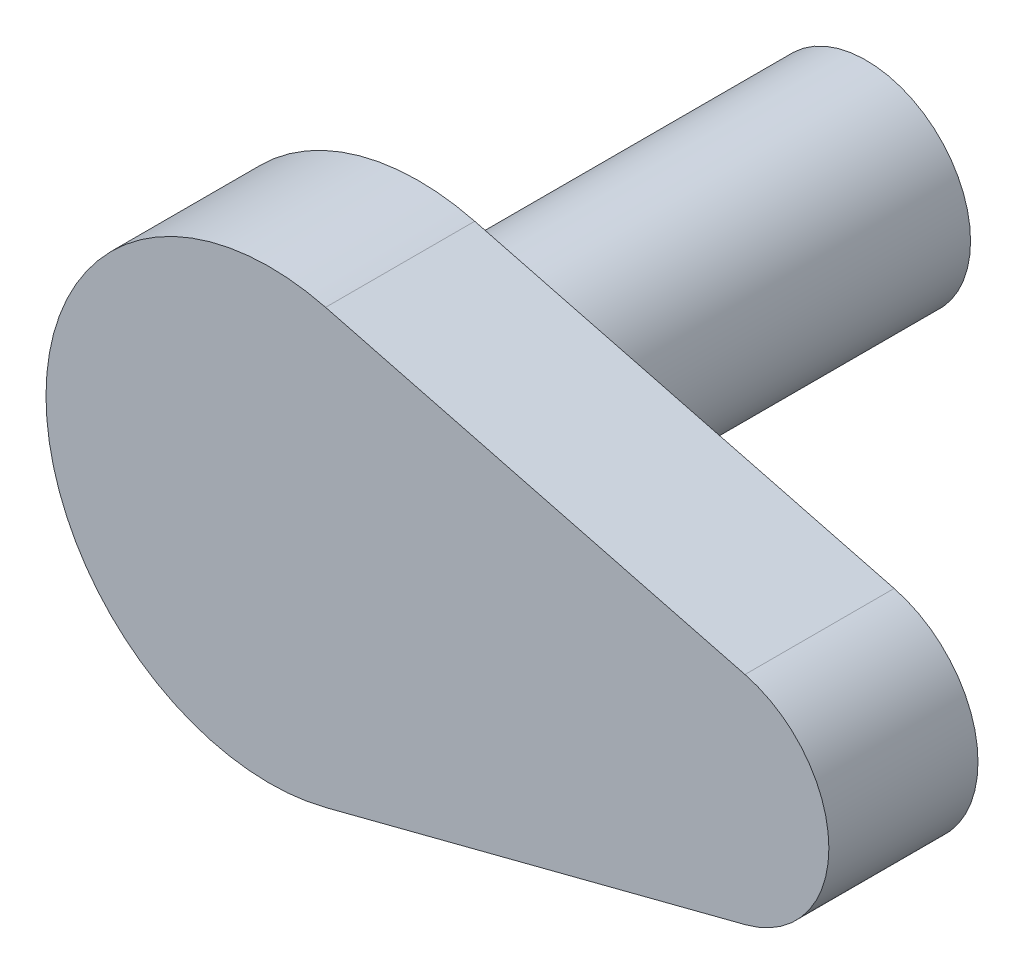
ISO-10303-21;
HEADER;
FILE_DESCRIPTION(('STEP AP214'),'2;1');
FILE_NAME('part.step','',(''),(''),'','','');
FILE_SCHEMA(('AUTOMOTIVE_DESIGN { 1 0 10303 214 1 1 1 1 }'));
ENDSEC;
DATA;
#1=APPLICATION_CONTEXT('core data for automotive mechanical design processes');
#2=APPLICATION_PROTOCOL_DEFINITION('international standard','automotive_design',2000,#1);
#3=PRODUCT_CONTEXT('',#1,'mechanical');
#4=PRODUCT('Part','Part','',(#3));
#5=PRODUCT_RELATED_PRODUCT_CATEGORY('part','',(#4));
#6=PRODUCT_DEFINITION_FORMATION('','',#4);
#7=PRODUCT_DEFINITION_CONTEXT('part definition',#1,'design');
#8=PRODUCT_DEFINITION('design','',#6,#7);
#9=PRODUCT_DEFINITION_SHAPE('','',#8);
#10=(LENGTH_UNIT() NAMED_UNIT(*) SI_UNIT(.MILLI.,.METRE.));
#11=(NAMED_UNIT(*) PLANE_ANGLE_UNIT() SI_UNIT($,.RADIAN.));
#12=(NAMED_UNIT(*) SI_UNIT($,.STERADIAN.) SOLID_ANGLE_UNIT());
#13=UNCERTAINTY_MEASURE_WITH_UNIT(LENGTH_MEASURE(1.E-05),#10,'distance_accuracy_value','');
#14=(GEOMETRIC_REPRESENTATION_CONTEXT(3) GLOBAL_UNCERTAINTY_ASSIGNED_CONTEXT((#13)) GLOBAL_UNIT_ASSIGNED_CONTEXT((#10,
#11,#12)) REPRESENTATION_CONTEXT('',''));
#15=CARTESIAN_POINT('',(0.,0.,0.));
#16=DIRECTION('',(0.,0.,1.));
#17=DIRECTION('',(1.,0.,0.));
#18=AXIS2_PLACEMENT_3D('',#15,#16,#17);
#19=CARTESIAN_POINT('',(0.,0.,30.));
#20=DIRECTION('',(0.,0.,-1.));
#21=DIRECTION('',(-1.,0.,0.));
#22=AXIS2_PLACEMENT_3D('',#19,#20,#21);
#23=CYLINDRICAL_SURFACE('',#22,7.);
#24=CARTESIAN_POINT('',(0.,0.,30.));
#25=DIRECTION('',(0.,0.,1.));
#26=DIRECTION('',(1.,0.,0.));
#27=AXIS2_PLACEMENT_3D('',#24,#25,#26);
#28=CIRCLE('',#27,7.);
#29=CARTESIAN_POINT('',(7.,0.,30.));
#30=VERTEX_POINT('',#29);
#31=EDGE_CURVE('E11',#30,#30,#28,.T.);
#32=ORIENTED_EDGE('',*,*,#31,.F.);
#33=EDGE_LOOP('',(#32));
#34=FACE_BOUND('',#33,.T.);
#35=CARTESIAN_POINT('',(0.,0.,0.));
#36=DIRECTION('',(0.,0.,1.));
#37=DIRECTION('',(1.,0.,0.));
#38=AXIS2_PLACEMENT_3D('',#35,#36,#37);
#39=CIRCLE('',#38,7.);
#40=CARTESIAN_POINT('',(7.,0.,0.));
#41=VERTEX_POINT('',#40);
#42=EDGE_CURVE('E36',#41,#41,#39,.T.);
#43=ORIENTED_EDGE('',*,*,#42,.T.);
#44=EDGE_LOOP('',(#43));
#45=FACE_BOUND('',#44,.T.);
#46=ADVANCED_FACE('F33',(#34,#45),#23,.T.);
#47=CARTESIAN_POINT('',(0.,0.,0.));
#48=DIRECTION('',(0.,0.,1.));
#49=DIRECTION('',(1.,0.,0.));
#50=AXIS2_PLACEMENT_3D('',#47,#48,#49);
#51=PLANE('',#50);
#52=ORIENTED_EDGE('',*,*,#42,.F.);
#53=EDGE_LOOP('',(#52));
#54=FACE_BOUND('',#53,.T.);
#55=ADVANCED_FACE('F112',(#54),#51,.F.);
#56=CARTESIAN_POINT('',(0.,0.,40.));
#57=DIRECTION('',(0.,0.,-1.));
#58=DIRECTION('',(-1.,0.,0.));
#59=AXIS2_PLACEMENT_3D('',#56,#57,#58);
#60=CYLINDRICAL_SURFACE('',#59,15.);
#61=CARTESIAN_POINT('',(0.,0.,30.));
#62=DIRECTION('',(0.,0.,1.));
#63=DIRECTION('',(-1.,0.,0.));
#64=AXIS2_PLACEMENT_3D('',#61,#62,#63);
#65=CIRCLE('',#64,15.);
#66=CARTESIAN_POINT('',(3.75,14.5236875482778,30.));
#67=VERTEX_POINT('',#66);
#68=CARTESIAN_POINT('',(3.75,-14.5236875482778,30.));
#69=VERTEX_POINT('',#68);
#70=EDGE_CURVE('E100',#67,#69,#65,.T.);
#71=ORIENTED_EDGE('',*,*,#70,.T.);
#72=DIRECTION('',(0.,0.,-1.));
#73=VECTOR('',#72,1.);
#74=CARTESIAN_POINT('',(3.75,-14.5236875482778,40.));
#75=LINE('',#74,#73);
#76=CARTESIAN_POINT('',(3.75,-14.5236875482778,40.));
#77=VERTEX_POINT('',#76);
#78=EDGE_CURVE('E91',#77,#69,#75,.T.);
#79=ORIENTED_EDGE('',*,*,#78,.F.);
#80=CARTESIAN_POINT('',(0.,0.,40.));
#81=DIRECTION('',(0.,0.,1.));
#82=DIRECTION('',(-1.,0.,0.));
#83=AXIS2_PLACEMENT_3D('',#80,#81,#82);
#84=CIRCLE('',#83,15.);
#85=CARTESIAN_POINT('',(3.75,14.5236875482778,40.));
#86=VERTEX_POINT('',#85);
#87=EDGE_CURVE('E85',#86,#77,#84,.T.);
#88=ORIENTED_EDGE('',*,*,#87,.F.);
#89=DIRECTION('',(0.,0.,-1.));
#90=VECTOR('',#89,1.);
#91=CARTESIAN_POINT('',(3.75,14.5236875482778,40.));
#92=LINE('',#91,#90);
#93=EDGE_CURVE('E96',#86,#67,#92,.T.);
#94=ORIENTED_EDGE('',*,*,#93,.T.);
#95=EDGE_LOOP('',(#71,#79,#88,#94));
#96=FACE_BOUND('',#95,.T.);
#97=ADVANCED_FACE('F114',(#96),#60,.T.);
#98=CARTESIAN_POINT('',(31.875,-7.26184377413891,40.));
#99=DIRECTION('',(-0.25,0.968245836551854,0.));
#100=DIRECTION('',(-0.968245836551854,-0.25,0.));
#101=AXIS2_PLACEMENT_3D('',#98,#99,#100);
#102=PLANE('',#101);
#103=DIRECTION('',(0.968245836551854,0.25,0.));
#104=VECTOR('',#103,1.);
#105=CARTESIAN_POINT('',(31.875,-7.26184377413891,30.));
#106=LINE('',#105,#104);
#107=CARTESIAN_POINT('',(31.875,-7.26184377413891,30.));
#108=VERTEX_POINT('',#107);
#109=EDGE_CURVE('E90',#69,#108,#106,.T.);
#110=ORIENTED_EDGE('',*,*,#109,.T.);
#111=DIRECTION('',(0.,0.,-1.));
#112=VECTOR('',#111,1.);
#113=CARTESIAN_POINT('',(31.875,-7.26184377413891,40.));
#114=LINE('',#113,#112);
#115=CARTESIAN_POINT('',(31.875,-7.26184377413891,40.));
#116=VERTEX_POINT('',#115);
#117=EDGE_CURVE('E88',#116,#108,#114,.T.);
#118=ORIENTED_EDGE('',*,*,#117,.F.);
#119=DIRECTION('',(0.968245836551854,0.25,0.));
#120=VECTOR('',#119,1.);
#121=CARTESIAN_POINT('',(31.875,-7.26184377413891,40.));
#122=LINE('',#121,#120);
#123=EDGE_CURVE('E80',#77,#116,#122,.T.);
#124=ORIENTED_EDGE('',*,*,#123,.F.);
#125=ORIENTED_EDGE('',*,*,#78,.T.);
#126=EDGE_LOOP('',(#110,#118,#124,#125));
#127=FACE_BOUND('',#126,.T.);
#128=ADVANCED_FACE('F89',(#127),#102,.F.);
#129=CARTESIAN_POINT('',(30.,0.,40.));
#130=DIRECTION('',(0.,0.,-1.));
#131=DIRECTION('',(-1.,0.,0.));
#132=AXIS2_PLACEMENT_3D('',#129,#130,#131);
#133=CYLINDRICAL_SURFACE('',#132,7.5);
#134=CARTESIAN_POINT('',(30.,0.,30.));
#135=DIRECTION('',(0.,0.,1.));
#136=DIRECTION('',(-1.,0.,0.));
#137=AXIS2_PLACEMENT_3D('',#134,#135,#136);
#138=CIRCLE('',#137,7.5);
#139=CARTESIAN_POINT('',(31.875,7.26184377413891,30.));
#140=VERTEX_POINT('',#139);
#141=EDGE_CURVE('E66',#108,#140,#138,.T.);
#142=ORIENTED_EDGE('',*,*,#141,.T.);
#143=DIRECTION('',(0.,0.,-1.));
#144=VECTOR('',#143,1.);
#145=CARTESIAN_POINT('',(31.875,7.26184377413891,40.));
#146=LINE('',#145,#144);
#147=CARTESIAN_POINT('',(31.875,7.26184377413891,40.));
#148=VERTEX_POINT('',#147);
#149=EDGE_CURVE('E92',#148,#140,#146,.T.);
#150=ORIENTED_EDGE('',*,*,#149,.F.);
#151=CARTESIAN_POINT('',(30.,0.,40.));
#152=DIRECTION('',(0.,0.,1.));
#153=DIRECTION('',(-1.,0.,0.));
#154=AXIS2_PLACEMENT_3D('',#151,#152,#153);
#155=CIRCLE('',#154,7.5);
#156=EDGE_CURVE('E83',#116,#148,#155,.T.);
#157=ORIENTED_EDGE('',*,*,#156,.F.);
#158=ORIENTED_EDGE('',*,*,#117,.T.);
#159=EDGE_LOOP('',(#142,#150,#157,#158));
#160=FACE_BOUND('',#159,.T.);
#161=ADVANCED_FACE('F94',(#160),#133,.T.);
#162=CARTESIAN_POINT('',(3.75,14.5236875482778,40.));
#163=DIRECTION('',(-0.25,-0.968245836551854,0.));
#164=DIRECTION('',(0.968245836551854,-0.25,0.));
#165=AXIS2_PLACEMENT_3D('',#162,#163,#164);
#166=PLANE('',#165);
#167=DIRECTION('',(-0.968245836551854,0.25,0.));
#168=VECTOR('',#167,1.);
#169=CARTESIAN_POINT('',(3.75,14.5236875482778,30.));
#170=LINE('',#169,#168);
#171=EDGE_CURVE('E72',#140,#67,#170,.T.);
#172=ORIENTED_EDGE('',*,*,#171,.T.);
#173=ORIENTED_EDGE('',*,*,#93,.F.);
#174=DIRECTION('',(-0.968245836551854,0.25,0.));
#175=VECTOR('',#174,1.);
#176=CARTESIAN_POINT('',(3.75,14.5236875482778,40.));
#177=LINE('',#176,#175);
#178=EDGE_CURVE('E49',#148,#86,#177,.T.);
#179=ORIENTED_EDGE('',*,*,#178,.F.);
#180=ORIENTED_EDGE('',*,*,#149,.T.);
#181=EDGE_LOOP('',(#172,#173,#179,#180));
#182=FACE_BOUND('',#181,.T.);
#183=ADVANCED_FACE('F127',(#182),#166,.F.);
#184=CARTESIAN_POINT('',(0.,0.,40.));
#185=DIRECTION('',(0.,0.,-1.));
#186=DIRECTION('',(-1.,0.,0.));
#187=AXIS2_PLACEMENT_3D('',#184,#185,#186);
#188=PLANE('',#187);
#189=ORIENTED_EDGE('',*,*,#87,.T.);
#190=ORIENTED_EDGE('',*,*,#123,.T.);
#191=ORIENTED_EDGE('',*,*,#156,.T.);
#192=ORIENTED_EDGE('',*,*,#178,.T.);
#193=EDGE_LOOP('',(#189,#190,#191,#192));
#194=FACE_BOUND('',#193,.T.);
#195=ADVANCED_FACE('F81',(#194),#188,.F.);
#196=CARTESIAN_POINT('',(0.,0.,30.));
#197=DIRECTION('',(0.,0.,-1.));
#198=DIRECTION('',(-1.,0.,0.));
#199=AXIS2_PLACEMENT_3D('',#196,#197,#198);
#200=PLANE('',#199);
#201=ORIENTED_EDGE('',*,*,#31,.T.);
#202=EDGE_LOOP('',(#201));
#203=FACE_BOUND('',#202,.T.);
#204=ORIENTED_EDGE('',*,*,#70,.F.);
#205=ORIENTED_EDGE('',*,*,#171,.F.);
#206=ORIENTED_EDGE('',*,*,#141,.F.);
#207=ORIENTED_EDGE('',*,*,#109,.F.);
#208=EDGE_LOOP('',(#204,#205,#206,#207));
#209=FACE_BOUND('',#208,.T.);
#210=ADVANCED_FACE('F130',(#203,#209),#200,.T.);
#211=CLOSED_SHELL('',(#46,#55,#97,#128,#161,#183,#195,#210));
#212=MANIFOLD_SOLID_BREP('B2',#211);
#213=ADVANCED_BREP_SHAPE_REPRESENTATION('',(#18,#212),#14);
#214=SHAPE_DEFINITION_REPRESENTATION(#9,#213);
ENDSEC;
END-ISO-10303-21;
